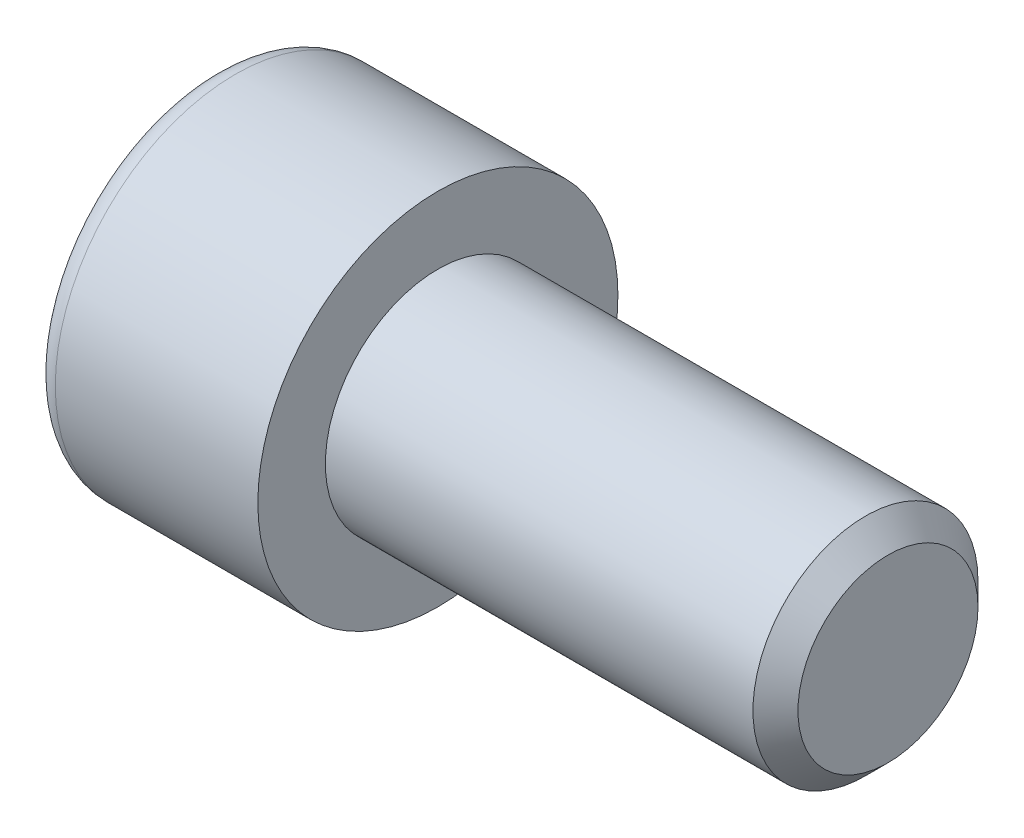
ISO-10303-21;
HEADER;
FILE_DESCRIPTION(('STEP AP214'),'2;1');
FILE_NAME('part.step','',(''),(''),'','','');
FILE_SCHEMA(('AUTOMOTIVE_DESIGN { 1 0 10303 214 1 1 1 1 }'));
ENDSEC;
DATA;
#1=APPLICATION_CONTEXT('core data for automotive mechanical design processes');
#2=APPLICATION_PROTOCOL_DEFINITION('international standard','automotive_design',2000,#1);
#3=PRODUCT_CONTEXT('',#1,'mechanical');
#4=PRODUCT('Part','Part','',(#3));
#5=PRODUCT_RELATED_PRODUCT_CATEGORY('part','',(#4));
#6=PRODUCT_DEFINITION_FORMATION('','',#4);
#7=PRODUCT_DEFINITION_CONTEXT('part definition',#1,'design');
#8=PRODUCT_DEFINITION('design','',#6,#7);
#9=PRODUCT_DEFINITION_SHAPE('','',#8);
#10=(LENGTH_UNIT() NAMED_UNIT(*) SI_UNIT(.MILLI.,.METRE.));
#11=(NAMED_UNIT(*) PLANE_ANGLE_UNIT() SI_UNIT($,.RADIAN.));
#12=(NAMED_UNIT(*) SI_UNIT($,.STERADIAN.) SOLID_ANGLE_UNIT());
#13=UNCERTAINTY_MEASURE_WITH_UNIT(LENGTH_MEASURE(1.E-05),#10,'distance_accuracy_value','');
#14=(GEOMETRIC_REPRESENTATION_CONTEXT(3) GLOBAL_UNCERTAINTY_ASSIGNED_CONTEXT((#13)) GLOBAL_UNIT_ASSIGNED_CONTEXT((#10,
#11,#12)) REPRESENTATION_CONTEXT('',''));
#15=CARTESIAN_POINT('',(0.,0.,0.));
#16=DIRECTION('',(0.,0.,1.));
#17=DIRECTION('',(1.,0.,0.));
#18=AXIS2_PLACEMENT_3D('',#15,#16,#17);
#19=CARTESIAN_POINT('',(5.,0.,0.));
#20=DIRECTION('',(1.,0.,0.));
#21=DIRECTION('',(0.,0.,-1.));
#22=AXIS2_PLACEMENT_3D('',#19,#20,#21);
#23=PLANE('',#22);
#24=CARTESIAN_POINT('',(5.,0.,0.));
#25=DIRECTION('',(1.,0.,0.));
#26=DIRECTION('',(0.,0.,-1.));
#27=AXIS2_PLACEMENT_3D('',#24,#25,#26);
#28=CIRCLE('',#27,4.);
#29=CARTESIAN_POINT('',(5.,0.,-4.));
#30=VERTEX_POINT('',#29);
#31=EDGE_CURVE('E144',#30,#30,#28,.T.);
#32=ORIENTED_EDGE('',*,*,#31,.T.);
#33=EDGE_LOOP('',(#32));
#34=FACE_BOUND('',#33,.T.);
#35=CARTESIAN_POINT('',(5.,0.,0.));
#36=DIRECTION('',(1.,0.,0.));
#37=DIRECTION('',(0.,0.,-1.));
#38=AXIS2_PLACEMENT_3D('',#35,#36,#37);
#39=CIRCLE('',#38,2.5);
#40=CARTESIAN_POINT('',(5.,0.,-2.5));
#41=VERTEX_POINT('',#40);
#42=EDGE_CURVE('E135',#41,#41,#39,.T.);
#43=ORIENTED_EDGE('',*,*,#42,.F.);
#44=EDGE_LOOP('',(#43));
#45=FACE_BOUND('',#44,.T.);
#46=ADVANCED_FACE('F29',(#34,#45),#23,.T.);
#47=CARTESIAN_POINT('',(5.,0.,0.));
#48=DIRECTION('',(-1.,0.,0.));
#49=DIRECTION('',(0.,0.,1.));
#50=AXIS2_PLACEMENT_3D('',#47,#48,#49);
#51=CYLINDRICAL_SURFACE('',#50,4.);
#52=CARTESIAN_POINT('',(0.5,0.,0.));
#53=DIRECTION('',(1.,0.,0.));
#54=DIRECTION('',(0.,0.,-1.));
#55=AXIS2_PLACEMENT_3D('',#52,#53,#54);
#56=CIRCLE('',#55,4.);
#57=CARTESIAN_POINT('',(0.5,0.,-4.));
#58=VERTEX_POINT('',#57);
#59=EDGE_CURVE('E37',#58,#58,#56,.T.);
#60=ORIENTED_EDGE('',*,*,#59,.T.);
#61=EDGE_LOOP('',(#60));
#62=FACE_BOUND('',#61,.T.);
#63=ORIENTED_EDGE('',*,*,#31,.F.);
#64=EDGE_LOOP('',(#63));
#65=FACE_BOUND('',#64,.T.);
#66=ADVANCED_FACE('F31',(#62,#65),#51,.T.);
#67=CARTESIAN_POINT('',(0.,0.,0.));
#68=DIRECTION('',(1.,0.,0.));
#69=DIRECTION('',(0.,0.,-1.));
#70=AXIS2_PLACEMENT_3D('',#67,#68,#69);
#71=PLANE('',#70);
#72=CARTESIAN_POINT('',(0.,0.,0.));
#73=DIRECTION('',(1.,0.,0.));
#74=DIRECTION('',(0.,0.,-1.));
#75=AXIS2_PLACEMENT_3D('',#72,#73,#74);
#76=CIRCLE('',#75,3.5);
#77=CARTESIAN_POINT('',(0.,0.,-3.5));
#78=VERTEX_POINT('',#77);
#79=EDGE_CURVE('E11',#78,#78,#76,.F.);
#80=ORIENTED_EDGE('',*,*,#79,.T.);
#81=EDGE_LOOP('',(#80));
#82=FACE_BOUND('',#81,.T.);
#83=DIRECTION('',(0.,-0.499999999999998,-0.86602540378444));
#84=VECTOR('',#83,1.);
#85=CARTESIAN_POINT('',(0.,2.30940107675851,0.));
#86=LINE('',#85,#84);
#87=CARTESIAN_POINT('',(0.,2.30940107675851,0.));
#88=VERTEX_POINT('',#87);
#89=CARTESIAN_POINT('',(0.,1.15470053837927,-2.));
#90=VERTEX_POINT('',#89);
#91=EDGE_CURVE('E111',#88,#90,#86,.T.);
#92=ORIENTED_EDGE('',*,*,#91,.F.);
#93=DIRECTION('',(0.,0.499999999999998,-0.86602540378444));
#94=VECTOR('',#93,1.);
#95=CARTESIAN_POINT('',(0.,1.15470053837926,2.));
#96=LINE('',#95,#94);
#97=CARTESIAN_POINT('',(0.,1.15470053837926,2.));
#98=VERTEX_POINT('',#97);
#99=EDGE_CURVE('E117',#98,#88,#96,.T.);
#100=ORIENTED_EDGE('',*,*,#99,.F.);
#101=DIRECTION('',(0.,1.,0.));
#102=VECTOR('',#101,1.);
#103=CARTESIAN_POINT('',(0.,-1.15470053837926,2.));
#104=LINE('',#103,#102);
#105=CARTESIAN_POINT('',(0.,-1.15470053837926,2.));
#106=VERTEX_POINT('',#105);
#107=EDGE_CURVE('E130',#106,#98,#104,.T.);
#108=ORIENTED_EDGE('',*,*,#107,.F.);
#109=DIRECTION('',(0.,0.499999999999998,0.86602540378444));
#110=VECTOR('',#109,1.);
#111=CARTESIAN_POINT('',(0.,-2.30940107675851,0.));
#112=LINE('',#111,#110);
#113=CARTESIAN_POINT('',(0.,-2.30940107675851,0.));
#114=VERTEX_POINT('',#113);
#115=EDGE_CURVE('E124',#114,#106,#112,.T.);
#116=ORIENTED_EDGE('',*,*,#115,.F.);
#117=DIRECTION('',(0.,-0.499999999999998,0.86602540378444));
#118=VECTOR('',#117,1.);
#119=CARTESIAN_POINT('',(0.,-1.15470053837927,-2.));
#120=LINE('',#119,#118);
#121=CARTESIAN_POINT('',(0.,-1.15470053837927,-2.));
#122=VERTEX_POINT('',#121);
#123=EDGE_CURVE('E122',#122,#114,#120,.T.);
#124=ORIENTED_EDGE('',*,*,#123,.F.);
#125=DIRECTION('',(0.,-1.,0.));
#126=VECTOR('',#125,1.);
#127=CARTESIAN_POINT('',(0.,1.15470053837927,-2.));
#128=LINE('',#127,#126);
#129=EDGE_CURVE('E103',#90,#122,#128,.T.);
#130=ORIENTED_EDGE('',*,*,#129,.F.);
#131=EDGE_LOOP('',(#92,#100,#108,#116,#124,#130));
#132=FACE_BOUND('',#131,.T.);
#133=ADVANCED_FACE('F119',(#82,#132),#71,.F.);
#134=CARTESIAN_POINT('',(15.,0.,0.));
#135=DIRECTION('',(-1.,0.,0.));
#136=DIRECTION('',(0.,0.,1.));
#137=AXIS2_PLACEMENT_3D('',#134,#135,#136);
#138=CYLINDRICAL_SURFACE('',#137,2.5);
#139=CARTESIAN_POINT('',(14.5,0.,0.));
#140=DIRECTION('',(1.,0.,0.));
#141=DIRECTION('',(0.,0.,-1.));
#142=AXIS2_PLACEMENT_3D('',#139,#140,#141);
#143=CIRCLE('',#142,2.5);
#144=CARTESIAN_POINT('',(14.5,0.,-2.5));
#145=VERTEX_POINT('',#144);
#146=EDGE_CURVE('E150',#145,#145,#143,.F.);
#147=ORIENTED_EDGE('',*,*,#146,.T.);
#148=EDGE_LOOP('',(#147));
#149=FACE_BOUND('',#148,.T.);
#150=ORIENTED_EDGE('',*,*,#42,.T.);
#151=EDGE_LOOP('',(#150));
#152=FACE_BOUND('',#151,.T.);
#153=ADVANCED_FACE('F203',(#149,#152),#138,.T.);
#154=CARTESIAN_POINT('',(15.,0.,0.));
#155=DIRECTION('',(1.,0.,0.));
#156=DIRECTION('',(0.,0.,-1.));
#157=AXIS2_PLACEMENT_3D('',#154,#155,#156);
#158=PLANE('',#157);
#159=CARTESIAN_POINT('',(15.,0.,0.));
#160=DIRECTION('',(1.,0.,0.));
#161=DIRECTION('',(0.,0.,-1.));
#162=AXIS2_PLACEMENT_3D('',#159,#160,#161);
#163=CIRCLE('',#162,2.);
#164=CARTESIAN_POINT('',(15.,0.,-2.));
#165=VERTEX_POINT('',#164);
#166=EDGE_CURVE('E147',#165,#165,#163,.T.);
#167=ORIENTED_EDGE('',*,*,#166,.T.);
#168=EDGE_LOOP('',(#167));
#169=FACE_BOUND('',#168,.T.);
#170=ADVANCED_FACE('F206',(#169),#158,.T.);
#171=CARTESIAN_POINT('',(15.,0.,0.));
#172=DIRECTION('',(-1.,0.,0.));
#173=DIRECTION('',(0.,0.,1.));
#174=AXIS2_PLACEMENT_3D('',#171,#172,#173);
#175=CONICAL_SURFACE('',#174,2.,0.785398163397443);
#176=ORIENTED_EDGE('',*,*,#146,.F.);
#177=EDGE_LOOP('',(#176));
#178=FACE_BOUND('',#177,.T.);
#179=ORIENTED_EDGE('',*,*,#166,.F.);
#180=EDGE_LOOP('',(#179));
#181=FACE_BOUND('',#180,.T.);
#182=ADVANCED_FACE('F210',(#178,#181),#175,.T.);
#183=CARTESIAN_POINT('',(4.,1.15470053837926,2.));
#184=DIRECTION('',(0.,0.86602540378444,0.499999999999998));
#185=DIRECTION('',(0.,-0.499999999999998,0.86602540378444));
#186=AXIS2_PLACEMENT_3D('',#183,#184,#185);
#187=PLANE('',#186);
#188=DIRECTION('',(-1.,0.,0.));
#189=VECTOR('',#188,1.);
#190=CARTESIAN_POINT('',(4.,2.30940107675851,0.));
#191=LINE('',#190,#189);
#192=CARTESIAN_POINT('',(3.,2.30940107675851,0.));
#193=VERTEX_POINT('',#192);
#194=EDGE_CURVE('E108',#193,#88,#191,.T.);
#195=ORIENTED_EDGE('',*,*,#194,.F.);
#196=DIRECTION('',(0.,0.499999999999998,-0.86602540378444));
#197=VECTOR('',#196,1.);
#198=CARTESIAN_POINT('',(3.,1.15470053837926,2.));
#199=LINE('',#198,#197);
#200=CARTESIAN_POINT('',(3.,1.15470053837926,2.));
#201=VERTEX_POINT('',#200);
#202=EDGE_CURVE('E166',#193,#201,#199,.F.);
#203=ORIENTED_EDGE('',*,*,#202,.T.);
#204=DIRECTION('',(-1.,0.,0.));
#205=VECTOR('',#204,1.);
#206=CARTESIAN_POINT('',(4.,1.15470053837926,2.));
#207=LINE('',#206,#205);
#208=EDGE_CURVE('E133',#201,#98,#207,.T.);
#209=ORIENTED_EDGE('',*,*,#208,.T.);
#210=ORIENTED_EDGE('',*,*,#99,.T.);
#211=EDGE_LOOP('',(#195,#203,#209,#210));
#212=FACE_BOUND('',#211,.T.);
#213=ADVANCED_FACE('F214',(#212),#187,.F.);
#214=CARTESIAN_POINT('',(4.,-1.15470053837926,2.));
#215=DIRECTION('',(0.,0.,1.));
#216=DIRECTION('',(1.,0.,0.));
#217=AXIS2_PLACEMENT_3D('',#214,#215,#216);
#218=PLANE('',#217);
#219=ORIENTED_EDGE('',*,*,#208,.F.);
#220=DIRECTION('',(0.,1.,0.));
#221=VECTOR('',#220,1.);
#222=CARTESIAN_POINT('',(3.,-1.15470053837926,2.));
#223=LINE('',#222,#221);
#224=CARTESIAN_POINT('',(3.,-1.15470053837926,2.));
#225=VERTEX_POINT('',#224);
#226=EDGE_CURVE('E169',#201,#225,#223,.F.);
#227=ORIENTED_EDGE('',*,*,#226,.T.);
#228=DIRECTION('',(-1.,0.,0.));
#229=VECTOR('',#228,1.);
#230=CARTESIAN_POINT('',(4.,-1.15470053837926,2.));
#231=LINE('',#230,#229);
#232=EDGE_CURVE('E136',#225,#106,#231,.T.);
#233=ORIENTED_EDGE('',*,*,#232,.T.);
#234=ORIENTED_EDGE('',*,*,#107,.T.);
#235=EDGE_LOOP('',(#219,#227,#233,#234));
#236=FACE_BOUND('',#235,.T.);
#237=ADVANCED_FACE('F218',(#236),#218,.F.);
#238=CARTESIAN_POINT('',(4.,-2.30940107675851,0.));
#239=DIRECTION('',(0.,-0.86602540378444,0.499999999999998));
#240=DIRECTION('',(0.,-0.499999999999998,-0.86602540378444));
#241=AXIS2_PLACEMENT_3D('',#238,#239,#240);
#242=PLANE('',#241);
#243=ORIENTED_EDGE('',*,*,#232,.F.);
#244=DIRECTION('',(0.,0.499999999999998,0.86602540378444));
#245=VECTOR('',#244,1.);
#246=CARTESIAN_POINT('',(3.,-2.30940107675851,0.));
#247=LINE('',#246,#245);
#248=CARTESIAN_POINT('',(3.,-2.30940107675851,0.));
#249=VERTEX_POINT('',#248);
#250=EDGE_CURVE('E171',#225,#249,#247,.F.);
#251=ORIENTED_EDGE('',*,*,#250,.T.);
#252=DIRECTION('',(-1.,0.,0.));
#253=VECTOR('',#252,1.);
#254=CARTESIAN_POINT('',(4.,-2.30940107675851,0.));
#255=LINE('',#254,#253);
#256=EDGE_CURVE('E138',#249,#114,#255,.T.);
#257=ORIENTED_EDGE('',*,*,#256,.T.);
#258=ORIENTED_EDGE('',*,*,#115,.T.);
#259=EDGE_LOOP('',(#243,#251,#257,#258));
#260=FACE_BOUND('',#259,.T.);
#261=ADVANCED_FACE('F228',(#260),#242,.F.);
#262=CARTESIAN_POINT('',(4.,-1.15470053837927,-2.));
#263=DIRECTION('',(0.,-0.86602540378444,-0.499999999999998));
#264=DIRECTION('',(0.,0.499999999999998,-0.86602540378444));
#265=AXIS2_PLACEMENT_3D('',#262,#263,#264);
#266=PLANE('',#265);
#267=ORIENTED_EDGE('',*,*,#256,.F.);
#268=DIRECTION('',(0.,-0.499999999999998,0.86602540378444));
#269=VECTOR('',#268,1.);
#270=CARTESIAN_POINT('',(3.,-1.15470053837927,-2.));
#271=LINE('',#270,#269);
#272=CARTESIAN_POINT('',(3.,-1.15470053837927,-2.));
#273=VERTEX_POINT('',#272);
#274=EDGE_CURVE('E52',#249,#273,#271,.F.);
#275=ORIENTED_EDGE('',*,*,#274,.T.);
#276=DIRECTION('',(-1.,0.,0.));
#277=VECTOR('',#276,1.);
#278=CARTESIAN_POINT('',(4.,-1.15470053837927,-2.));
#279=LINE('',#278,#277);
#280=EDGE_CURVE('E107',#273,#122,#279,.T.);
#281=ORIENTED_EDGE('',*,*,#280,.T.);
#282=ORIENTED_EDGE('',*,*,#123,.T.);
#283=EDGE_LOOP('',(#267,#275,#281,#282));
#284=FACE_BOUND('',#283,.T.);
#285=ADVANCED_FACE('F225',(#284),#266,.F.);
#286=CARTESIAN_POINT('',(4.,1.15470053837927,-2.));
#287=DIRECTION('',(0.,0.,-1.));
#288=DIRECTION('',(-1.,0.,0.));
#289=AXIS2_PLACEMENT_3D('',#286,#287,#288);
#290=PLANE('',#289);
#291=ORIENTED_EDGE('',*,*,#280,.F.);
#292=DIRECTION('',(0.,-1.,0.));
#293=VECTOR('',#292,1.);
#294=CARTESIAN_POINT('',(3.,1.15470053837927,-2.));
#295=LINE('',#294,#293);
#296=CARTESIAN_POINT('',(3.,1.15470053837927,-2.));
#297=VERTEX_POINT('',#296);
#298=EDGE_CURVE('E44',#273,#297,#295,.F.);
#299=ORIENTED_EDGE('',*,*,#298,.T.);
#300=DIRECTION('',(-1.,0.,0.));
#301=VECTOR('',#300,1.);
#302=CARTESIAN_POINT('',(4.,1.15470053837927,-2.));
#303=LINE('',#302,#301);
#304=EDGE_CURVE('E99',#297,#90,#303,.T.);
#305=ORIENTED_EDGE('',*,*,#304,.T.);
#306=ORIENTED_EDGE('',*,*,#129,.T.);
#307=EDGE_LOOP('',(#291,#299,#305,#306));
#308=FACE_BOUND('',#307,.T.);
#309=ADVANCED_FACE('F101',(#308),#290,.F.);
#310=CARTESIAN_POINT('',(4.,2.30940107675851,0.));
#311=DIRECTION('',(0.,0.86602540378444,-0.499999999999998));
#312=DIRECTION('',(0.,0.499999999999998,0.86602540378444));
#313=AXIS2_PLACEMENT_3D('',#310,#311,#312);
#314=PLANE('',#313);
#315=ORIENTED_EDGE('',*,*,#304,.F.);
#316=DIRECTION('',(0.,-0.499999999999998,-0.86602540378444));
#317=VECTOR('',#316,1.);
#318=CARTESIAN_POINT('',(3.,2.30940107675851,0.));
#319=LINE('',#318,#317);
#320=EDGE_CURVE('E175',#297,#193,#319,.F.);
#321=ORIENTED_EDGE('',*,*,#320,.T.);
#322=ORIENTED_EDGE('',*,*,#194,.T.);
#323=ORIENTED_EDGE('',*,*,#91,.T.);
#324=EDGE_LOOP('',(#315,#321,#322,#323));
#325=FACE_BOUND('',#324,.T.);
#326=ADVANCED_FACE('F112',(#325),#314,.F.);
#327=CARTESIAN_POINT('',(4.,3.46410161513776,-2.));
#328=DIRECTION('',(-1.,0.,0.));
#329=DIRECTION('',(0.,0.,1.));
#330=AXIS2_PLACEMENT_3D('',#327,#328,#329);
#331=PLANE('',#330);
#332=DIRECTION('',(0.,1.,0.));
#333=VECTOR('',#332,1.);
#334=CARTESIAN_POINT('',(4.,3.46410161513776,1.));
#335=LINE('',#334,#333);
#336=CARTESIAN_POINT('',(4.,-0.577350269189637,1.));
#337=VERTEX_POINT('',#336);
#338=CARTESIAN_POINT('',(4.,0.577350269189636,1.));
#339=VERTEX_POINT('',#338);
#340=EDGE_CURVE('E161',#337,#339,#335,.T.);
#341=ORIENTED_EDGE('',*,*,#340,.T.);
#342=DIRECTION('',(0.,0.499999999999998,-0.86602540378444));
#343=VECTOR('',#342,1.);
#344=CARTESIAN_POINT('',(4.,2.59807621135332,-2.5));
#345=LINE('',#344,#343);
#346=CARTESIAN_POINT('',(4.,1.15470053837926,0.));
#347=VERTEX_POINT('',#346);
#348=EDGE_CURVE('E163',#339,#347,#345,.T.);
#349=ORIENTED_EDGE('',*,*,#348,.T.);
#350=DIRECTION('',(0.,-0.499999999999998,-0.86602540378444));
#351=VECTOR('',#350,1.);
#352=CARTESIAN_POINT('',(4.,0.866025403784443,-0.500000000000011));
#353=LINE('',#352,#351);
#354=CARTESIAN_POINT('',(4.,0.577350269189639,-0.999999999999999));
#355=VERTEX_POINT('',#354);
#356=EDGE_CURVE('E153',#347,#355,#353,.T.);
#357=ORIENTED_EDGE('',*,*,#356,.T.);
#358=DIRECTION('',(0.,-1.,0.));
#359=VECTOR('',#358,1.);
#360=CARTESIAN_POINT('',(4.,3.46410161513776,-0.999999999999999));
#361=LINE('',#360,#359);
#362=CARTESIAN_POINT('',(4.,-0.577350269189639,-0.999999999999999));
#363=VERTEX_POINT('',#362);
#364=EDGE_CURVE('E155',#355,#363,#361,.T.);
#365=ORIENTED_EDGE('',*,*,#364,.T.);
#366=DIRECTION('',(0.,-0.499999999999998,0.86602540378444));
#367=VECTOR('',#366,1.);
#368=CARTESIAN_POINT('',(4.,0.866025403784417,-3.5));
#369=LINE('',#368,#367);
#370=CARTESIAN_POINT('',(4.,-1.15470053837926,0.));
#371=VERTEX_POINT('',#370);
#372=EDGE_CURVE('E157',#363,#371,#369,.T.);
#373=ORIENTED_EDGE('',*,*,#372,.T.);
#374=DIRECTION('',(0.,0.499999999999998,0.86602540378444));
#375=VECTOR('',#374,1.);
#376=CARTESIAN_POINT('',(4.,-0.866025403784451,0.499999999999997));
#377=LINE('',#376,#375);
#378=EDGE_CURVE('E159',#371,#337,#377,.T.);
#379=ORIENTED_EDGE('',*,*,#378,.T.);
#380=EDGE_LOOP('',(#341,#349,#357,#365,#373,#379));
#381=FACE_BOUND('',#380,.T.);
#382=ADVANCED_FACE('F222',(#381),#331,.T.);
#383=CARTESIAN_POINT('',(3.,0.866025403784418,-3.5));
#384=DIRECTION('',(0.,-0.499999999999998,0.86602540378444));
#385=DIRECTION('',(0.,-0.86602540378444,-0.499999999999998));
#386=AXIS2_PLACEMENT_3D('',#383,#384,#385);
#387=CYLINDRICAL_SURFACE('',#386,1.);
#388=CARTESIAN_POINT('',(3.,-0.577350269189638,-0.999999999999999));
#389=DIRECTION('',(0.,-0.866025403784438,0.500000000000001));
#390=DIRECTION('',(0.,0.500000000000001,0.866025403784438));
#391=AXIS2_PLACEMENT_3D('',#388,#389,#390);
#392=ELLIPSE('',#391,1.15470053837925,1.);
#393=EDGE_CURVE('E268',#273,#363,#392,.T.);
#394=ORIENTED_EDGE('',*,*,#393,.F.);
#395=ORIENTED_EDGE('',*,*,#274,.F.);
#396=CARTESIAN_POINT('',(3.,-1.15470053837926,0.));
#397=DIRECTION('',(0.,0.,1.));
#398=DIRECTION('',(0.,1.,0.));
#399=AXIS2_PLACEMENT_3D('',#396,#397,#398);
#400=ELLIPSE('',#399,1.15470053837925,1.);
#401=EDGE_CURVE('E276',#371,#249,#400,.F.);
#402=ORIENTED_EDGE('',*,*,#401,.F.);
#403=ORIENTED_EDGE('',*,*,#372,.F.);
#404=EDGE_LOOP('',(#394,#395,#402,#403));
#405=FACE_BOUND('',#404,.T.);
#406=ADVANCED_FACE('F237',(#405),#387,.F.);
#407=CARTESIAN_POINT('',(3.,-0.866025403784451,0.499999999999997));
#408=DIRECTION('',(0.,0.499999999999998,0.86602540378444));
#409=DIRECTION('',(0.,-0.86602540378444,0.499999999999998));
#410=AXIS2_PLACEMENT_3D('',#407,#408,#409);
#411=CYLINDRICAL_SURFACE('',#410,1.);
#412=ORIENTED_EDGE('',*,*,#401,.T.);
#413=ORIENTED_EDGE('',*,*,#250,.F.);
#414=CARTESIAN_POINT('',(3.,-0.577350269189636,1.));
#415=DIRECTION('',(0.,0.866025403784438,0.500000000000001));
#416=DIRECTION('',(0.,0.500000000000001,-0.866025403784438));
#417=AXIS2_PLACEMENT_3D('',#414,#415,#416);
#418=ELLIPSE('',#417,1.15470053837925,1.);
#419=EDGE_CURVE('E264',#337,#225,#418,.F.);
#420=ORIENTED_EDGE('',*,*,#419,.F.);
#421=ORIENTED_EDGE('',*,*,#378,.F.);
#422=EDGE_LOOP('',(#412,#413,#420,#421));
#423=FACE_BOUND('',#422,.T.);
#424=ADVANCED_FACE('F241',(#423),#411,.F.);
#425=CARTESIAN_POINT('',(3.,3.46410161513776,-0.999999999999999));
#426=DIRECTION('',(0.,-1.,0.));
#427=DIRECTION('',(0.,0.,-1.));
#428=AXIS2_PLACEMENT_3D('',#425,#426,#427);
#429=CYLINDRICAL_SURFACE('',#428,1.);
#430=ORIENTED_EDGE('',*,*,#393,.T.);
#431=ORIENTED_EDGE('',*,*,#364,.F.);
#432=CARTESIAN_POINT('',(3.,0.577350269189639,-0.999999999999999));
#433=DIRECTION('',(0.,-0.866025403784438,-0.500000000000001));
#434=DIRECTION('',(0.,-0.500000000000001,0.866025403784438));
#435=AXIS2_PLACEMENT_3D('',#432,#433,#434);
#436=ELLIPSE('',#435,1.15470053837925,1.);
#437=EDGE_CURVE('E261',#297,#355,#436,.T.);
#438=ORIENTED_EDGE('',*,*,#437,.F.);
#439=ORIENTED_EDGE('',*,*,#298,.F.);
#440=EDGE_LOOP('',(#430,#431,#438,#439));
#441=FACE_BOUND('',#440,.T.);
#442=ADVANCED_FACE('F245',(#441),#429,.F.);
#443=CARTESIAN_POINT('',(3.,3.46410161513776,1.));
#444=DIRECTION('',(0.,1.,0.));
#445=DIRECTION('',(0.,0.,1.));
#446=AXIS2_PLACEMENT_3D('',#443,#444,#445);
#447=CYLINDRICAL_SURFACE('',#446,1.);
#448=ORIENTED_EDGE('',*,*,#419,.T.);
#449=ORIENTED_EDGE('',*,*,#226,.F.);
#450=CARTESIAN_POINT('',(3.,0.577350269189636,1.));
#451=DIRECTION('',(0.,0.866025403784438,-0.500000000000001));
#452=DIRECTION('',(0.,-0.500000000000001,-0.866025403784438));
#453=AXIS2_PLACEMENT_3D('',#450,#451,#452);
#454=ELLIPSE('',#453,1.15470053837925,1.);
#455=EDGE_CURVE('E265',#339,#201,#454,.F.);
#456=ORIENTED_EDGE('',*,*,#455,.F.);
#457=ORIENTED_EDGE('',*,*,#340,.F.);
#458=EDGE_LOOP('',(#448,#449,#456,#457));
#459=FACE_BOUND('',#458,.T.);
#460=ADVANCED_FACE('F249',(#459),#447,.F.);
#461=CARTESIAN_POINT('',(3.,0.866025403784443,-0.500000000000011));
#462=DIRECTION('',(0.,-0.499999999999998,-0.86602540378444));
#463=DIRECTION('',(0.,0.86602540378444,-0.499999999999998));
#464=AXIS2_PLACEMENT_3D('',#461,#462,#463);
#465=CYLINDRICAL_SURFACE('',#464,1.);
#466=ORIENTED_EDGE('',*,*,#437,.T.);
#467=ORIENTED_EDGE('',*,*,#356,.F.);
#468=CARTESIAN_POINT('',(3.,1.15470053837926,0.));
#469=DIRECTION('',(0.,0.,-1.));
#470=DIRECTION('',(0.,1.,0.));
#471=AXIS2_PLACEMENT_3D('',#468,#469,#470);
#472=ELLIPSE('',#471,1.15470053837925,1.);
#473=EDGE_CURVE('E270',#193,#347,#472,.T.);
#474=ORIENTED_EDGE('',*,*,#473,.F.);
#475=ORIENTED_EDGE('',*,*,#320,.F.);
#476=EDGE_LOOP('',(#466,#467,#474,#475));
#477=FACE_BOUND('',#476,.T.);
#478=ADVANCED_FACE('F190',(#477),#465,.F.);
#479=CARTESIAN_POINT('',(3.,2.59807621135332,-2.5));
#480=DIRECTION('',(0.,0.499999999999998,-0.86602540378444));
#481=DIRECTION('',(0.,0.86602540378444,0.499999999999998));
#482=AXIS2_PLACEMENT_3D('',#479,#480,#481);
#483=CYLINDRICAL_SURFACE('',#482,1.);
#484=ORIENTED_EDGE('',*,*,#455,.T.);
#485=ORIENTED_EDGE('',*,*,#202,.F.);
#486=ORIENTED_EDGE('',*,*,#473,.T.);
#487=ORIENTED_EDGE('',*,*,#348,.F.);
#488=EDGE_LOOP('',(#484,#485,#486,#487));
#489=FACE_BOUND('',#488,.T.);
#490=ADVANCED_FACE('F183',(#489),#483,.F.);
#491=CARTESIAN_POINT('',(0.5,0.,0.));
#492=DIRECTION('',(1.,0.,0.));
#493=DIRECTION('',(0.,0.,-1.));
#494=AXIS2_PLACEMENT_3D('',#491,#492,#493);
#495=TOROIDAL_SURFACE('',#494,3.5,0.5);
#496=ORIENTED_EDGE('',*,*,#79,.F.);
#497=EDGE_LOOP('',(#496));
#498=FACE_BOUND('',#497,.T.);
#499=ORIENTED_EDGE('',*,*,#59,.F.);
#500=EDGE_LOOP('',(#499));
#501=FACE_BOUND('',#500,.T.);
#502=ADVANCED_FACE('F181',(#498,#501),#495,.T.);
#503=CLOSED_SHELL('',(#46,#66,#133,#153,#170,#182,#213,#237,#261,#285,#309,#326,#382,#406,#424,
#442,#460,#478,#490,#502));
#504=MANIFOLD_SOLID_BREP('B2',#503);
#505=ADVANCED_BREP_SHAPE_REPRESENTATION('',(#18,#504),#14);
#506=SHAPE_DEFINITION_REPRESENTATION(#9,#505);
ENDSEC;
END-ISO-10303-21;
